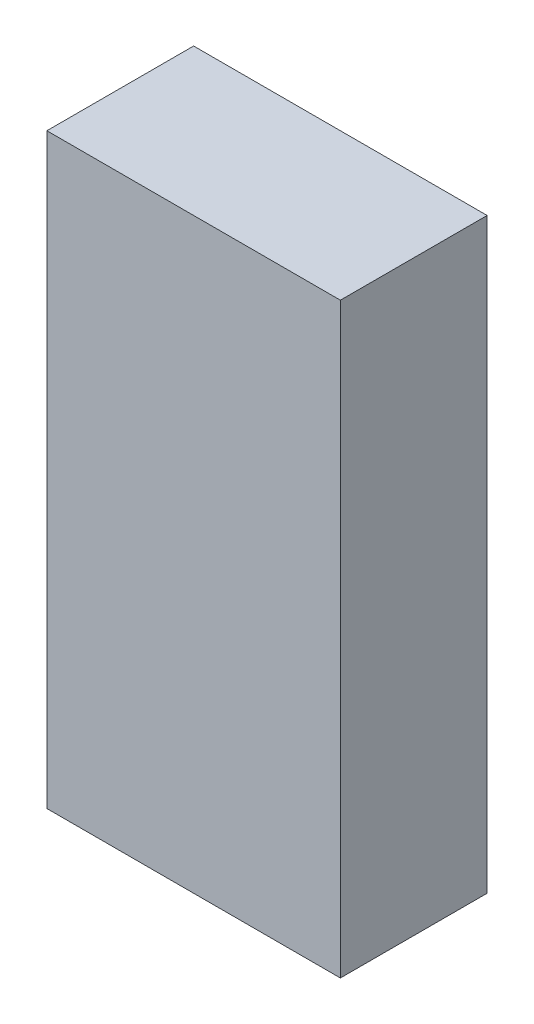
ISO-10303-21;
HEADER;
FILE_DESCRIPTION(('STEP AP214'),'2;1');
FILE_NAME('part.step','',(''),(''),'','','');
FILE_SCHEMA(('AUTOMOTIVE_DESIGN { 1 0 10303 214 1 1 1 1 }'));
ENDSEC;
DATA;
#1=APPLICATION_CONTEXT('core data for automotive mechanical design processes');
#2=APPLICATION_PROTOCOL_DEFINITION('international standard','automotive_design',2000,#1);
#3=PRODUCT_CONTEXT('',#1,'mechanical');
#4=PRODUCT('Part','Part','',(#3));
#5=PRODUCT_RELATED_PRODUCT_CATEGORY('part','',(#4));
#6=PRODUCT_DEFINITION_FORMATION('','',#4);
#7=PRODUCT_DEFINITION_CONTEXT('part definition',#1,'design');
#8=PRODUCT_DEFINITION('design','',#6,#7);
#9=PRODUCT_DEFINITION_SHAPE('','',#8);
#10=(LENGTH_UNIT() NAMED_UNIT(*) SI_UNIT(.MILLI.,.METRE.));
#11=(NAMED_UNIT(*) PLANE_ANGLE_UNIT() SI_UNIT($,.RADIAN.));
#12=(NAMED_UNIT(*) SI_UNIT($,.STERADIAN.) SOLID_ANGLE_UNIT());
#13=UNCERTAINTY_MEASURE_WITH_UNIT(LENGTH_MEASURE(1.E-05),#10,'distance_accuracy_value','');
#14=(GEOMETRIC_REPRESENTATION_CONTEXT(3) GLOBAL_UNCERTAINTY_ASSIGNED_CONTEXT((#13)) GLOBAL_UNIT_ASSIGNED_CONTEXT((#10,
#11,#12)) REPRESENTATION_CONTEXT('',''));
#15=CARTESIAN_POINT('',(0.,0.,0.));
#16=DIRECTION('',(0.,0.,1.));
#17=DIRECTION('',(1.,0.,0.));
#18=AXIS2_PLACEMENT_3D('',#15,#16,#17);
#19=CARTESIAN_POINT('',(13.370501893252,0.,10.));
#20=DIRECTION('',(-1.,0.,0.));
#21=DIRECTION('',(0.,-1.,0.));
#22=AXIS2_PLACEMENT_3D('',#19,#20,#21);
#23=PLANE('',#22);
#24=DIRECTION('',(0.,1.,0.));
#25=VECTOR('',#24,1.);
#26=CARTESIAN_POINT('',(13.370501893252,0.,0.));
#27=LINE('',#26,#25);
#28=CARTESIAN_POINT('',(13.370501893252,-20.,0.));
#29=VERTEX_POINT('',#28);
#30=CARTESIAN_POINT('',(13.370501893252,20.,0.));
#31=VERTEX_POINT('',#30);
#32=EDGE_CURVE('E98',#29,#31,#27,.T.);
#33=ORIENTED_EDGE('',*,*,#32,.F.);
#34=DIRECTION('',(0.,0.,-1.));
#35=VECTOR('',#34,1.);
#36=CARTESIAN_POINT('',(13.370501893252,-20.,10.));
#37=LINE('',#36,#35);
#38=CARTESIAN_POINT('',(13.370501893252,-20.,10.));
#39=VERTEX_POINT('',#38);
#40=EDGE_CURVE('E11',#39,#29,#37,.T.);
#41=ORIENTED_EDGE('',*,*,#40,.F.);
#42=DIRECTION('',(0.,1.,0.));
#43=VECTOR('',#42,1.);
#44=CARTESIAN_POINT('',(13.370501893252,0.,10.));
#45=LINE('',#44,#43);
#46=CARTESIAN_POINT('',(13.370501893252,20.,10.));
#47=VERTEX_POINT('',#46);
#48=EDGE_CURVE('E83',#39,#47,#45,.T.);
#49=ORIENTED_EDGE('',*,*,#48,.T.);
#50=DIRECTION('',(0.,0.,-1.));
#51=VECTOR('',#50,1.);
#52=CARTESIAN_POINT('',(13.370501893252,20.,10.));
#53=LINE('',#52,#51);
#54=EDGE_CURVE('E51',#47,#31,#53,.T.);
#55=ORIENTED_EDGE('',*,*,#54,.T.);
#56=EDGE_LOOP('',(#33,#41,#49,#55));
#57=FACE_BOUND('',#56,.T.);
#58=ADVANCED_FACE('F35',(#57),#23,.T.);
#59=CARTESIAN_POINT('',(0.,-20.,10.));
#60=DIRECTION('',(0.,1.,0.));
#61=DIRECTION('',(0.,0.,1.));
#62=AXIS2_PLACEMENT_3D('',#59,#60,#61);
#63=PLANE('',#62);
#64=DIRECTION('',(1.,0.,0.));
#65=VECTOR('',#64,1.);
#66=CARTESIAN_POINT('',(0.,-20.,0.));
#67=LINE('',#66,#65);
#68=CARTESIAN_POINT('',(33.370501893252,-20.,0.));
#69=VERTEX_POINT('',#68);
#70=EDGE_CURVE('E89',#29,#69,#67,.T.);
#71=ORIENTED_EDGE('',*,*,#70,.T.);
#72=DIRECTION('',(0.,0.,-1.));
#73=VECTOR('',#72,1.);
#74=CARTESIAN_POINT('',(33.370501893252,-20.,10.));
#75=LINE('',#74,#73);
#76=CARTESIAN_POINT('',(33.370501893252,-20.,10.));
#77=VERTEX_POINT('',#76);
#78=EDGE_CURVE('E43',#77,#69,#75,.T.);
#79=ORIENTED_EDGE('',*,*,#78,.F.);
#80=DIRECTION('',(1.,0.,0.));
#81=VECTOR('',#80,1.);
#82=CARTESIAN_POINT('',(0.,-20.,10.));
#83=LINE('',#82,#81);
#84=EDGE_CURVE('E77',#39,#77,#83,.T.);
#85=ORIENTED_EDGE('',*,*,#84,.F.);
#86=ORIENTED_EDGE('',*,*,#40,.T.);
#87=EDGE_LOOP('',(#71,#79,#85,#86));
#88=FACE_BOUND('',#87,.T.);
#89=ADVANCED_FACE('F87',(#88),#63,.F.);
#90=CARTESIAN_POINT('',(33.370501893252,0.,10.));
#91=DIRECTION('',(-1.,0.,0.));
#92=DIRECTION('',(0.,-1.,0.));
#93=AXIS2_PLACEMENT_3D('',#90,#91,#92);
#94=PLANE('',#93);
#95=DIRECTION('',(0.,1.,0.));
#96=VECTOR('',#95,1.);
#97=CARTESIAN_POINT('',(33.370501893252,0.,0.));
#98=LINE('',#97,#96);
#99=CARTESIAN_POINT('',(33.370501893252,20.,0.));
#100=VERTEX_POINT('',#99);
#101=EDGE_CURVE('E101',#69,#100,#98,.T.);
#102=ORIENTED_EDGE('',*,*,#101,.T.);
#103=DIRECTION('',(0.,0.,-1.));
#104=VECTOR('',#103,1.);
#105=CARTESIAN_POINT('',(33.370501893252,20.,10.));
#106=LINE('',#105,#104);
#107=CARTESIAN_POINT('',(33.370501893252,20.,10.));
#108=VERTEX_POINT('',#107);
#109=EDGE_CURVE('E65',#108,#100,#106,.T.);
#110=ORIENTED_EDGE('',*,*,#109,.F.);
#111=DIRECTION('',(0.,1.,0.));
#112=VECTOR('',#111,1.);
#113=CARTESIAN_POINT('',(33.370501893252,0.,10.));
#114=LINE('',#113,#112);
#115=EDGE_CURVE('E82',#77,#108,#114,.T.);
#116=ORIENTED_EDGE('',*,*,#115,.F.);
#117=ORIENTED_EDGE('',*,*,#78,.T.);
#118=EDGE_LOOP('',(#102,#110,#116,#117));
#119=FACE_BOUND('',#118,.T.);
#120=ADVANCED_FACE('F92',(#119),#94,.F.);
#121=CARTESIAN_POINT('',(0.,20.,10.));
#122=DIRECTION('',(0.,1.,0.));
#123=DIRECTION('',(-1.,0.,0.));
#124=AXIS2_PLACEMENT_3D('',#121,#122,#123);
#125=PLANE('',#124);
#126=DIRECTION('',(1.,0.,0.));
#127=VECTOR('',#126,1.);
#128=CARTESIAN_POINT('',(0.,20.,0.));
#129=LINE('',#128,#127);
#130=EDGE_CURVE('E103',#31,#100,#129,.T.);
#131=ORIENTED_EDGE('',*,*,#130,.F.);
#132=ORIENTED_EDGE('',*,*,#54,.F.);
#133=DIRECTION('',(1.,0.,0.));
#134=VECTOR('',#133,1.);
#135=CARTESIAN_POINT('',(0.,20.,10.));
#136=LINE('',#135,#134);
#137=EDGE_CURVE('E93',#47,#108,#136,.T.);
#138=ORIENTED_EDGE('',*,*,#137,.T.);
#139=ORIENTED_EDGE('',*,*,#109,.T.);
#140=EDGE_LOOP('',(#131,#132,#138,#139));
#141=FACE_BOUND('',#140,.T.);
#142=ADVANCED_FACE('F108',(#141),#125,.T.);
#143=CARTESIAN_POINT('',(0.,0.,10.));
#144=DIRECTION('',(0.,0.,1.));
#145=DIRECTION('',(1.,0.,0.));
#146=AXIS2_PLACEMENT_3D('',#143,#144,#145);
#147=PLANE('',#146);
#148=ORIENTED_EDGE('',*,*,#48,.F.);
#149=ORIENTED_EDGE('',*,*,#84,.T.);
#150=ORIENTED_EDGE('',*,*,#115,.T.);
#151=ORIENTED_EDGE('',*,*,#137,.F.);
#152=EDGE_LOOP('',(#148,#149,#150,#151));
#153=FACE_BOUND('',#152,.T.);
#154=ADVANCED_FACE('F79',(#153),#147,.T.);
#155=CARTESIAN_POINT('',(0.,0.,0.));
#156=DIRECTION('',(0.,0.,1.));
#157=DIRECTION('',(1.,0.,0.));
#158=AXIS2_PLACEMENT_3D('',#155,#156,#157);
#159=PLANE('',#158);
#160=ORIENTED_EDGE('',*,*,#32,.T.);
#161=ORIENTED_EDGE('',*,*,#130,.T.);
#162=ORIENTED_EDGE('',*,*,#101,.F.);
#163=ORIENTED_EDGE('',*,*,#70,.F.);
#164=EDGE_LOOP('',(#160,#161,#162,#163));
#165=FACE_BOUND('',#164,.T.);
#166=ADVANCED_FACE('F115',(#165),#159,.F.);
#167=CLOSED_SHELL('',(#58,#89,#120,#142,#154,#166));
#168=MANIFOLD_SOLID_BREP('B2',#167);
#169=ADVANCED_BREP_SHAPE_REPRESENTATION('',(#18,#168),#14);
#170=SHAPE_DEFINITION_REPRESENTATION(#9,#169);
ENDSEC;
END-ISO-10303-21;
